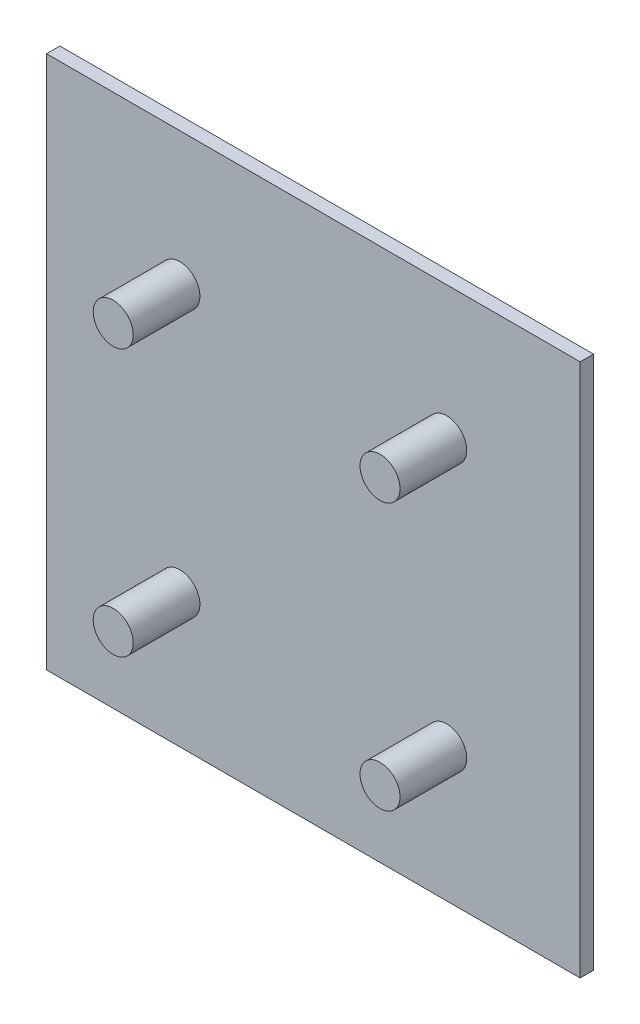
ISO-10303-21;
HEADER;
FILE_DESCRIPTION(('STEP AP214'),'2;1');
FILE_NAME('part.step','',(''),(''),'','','');
FILE_SCHEMA(('AUTOMOTIVE_DESIGN { 1 0 10303 214 1 1 1 1 }'));
ENDSEC;
DATA;
#1=APPLICATION_CONTEXT('core data for automotive mechanical design processes');
#2=APPLICATION_PROTOCOL_DEFINITION('international standard','automotive_design',2000,#1);
#3=PRODUCT_CONTEXT('',#1,'mechanical');
#4=PRODUCT('Part','Part','',(#3));
#5=PRODUCT_RELATED_PRODUCT_CATEGORY('part','',(#4));
#6=PRODUCT_DEFINITION_FORMATION('','',#4);
#7=PRODUCT_DEFINITION_CONTEXT('part definition',#1,'design');
#8=PRODUCT_DEFINITION('design','',#6,#7);
#9=PRODUCT_DEFINITION_SHAPE('','',#8);
#10=(LENGTH_UNIT() NAMED_UNIT(*) SI_UNIT(.MILLI.,.METRE.));
#11=(NAMED_UNIT(*) PLANE_ANGLE_UNIT() SI_UNIT($,.RADIAN.));
#12=(NAMED_UNIT(*) SI_UNIT($,.STERADIAN.) SOLID_ANGLE_UNIT());
#13=UNCERTAINTY_MEASURE_WITH_UNIT(LENGTH_MEASURE(1.E-05),#10,'distance_accuracy_value','');
#14=(GEOMETRIC_REPRESENTATION_CONTEXT(3) GLOBAL_UNCERTAINTY_ASSIGNED_CONTEXT((#13)) GLOBAL_UNIT_ASSIGNED_CONTEXT((#10,
#11,#12)) REPRESENTATION_CONTEXT('',''));
#15=CARTESIAN_POINT('',(0.,0.,0.));
#16=DIRECTION('',(0.,0.,1.));
#17=DIRECTION('',(1.,0.,0.));
#18=AXIS2_PLACEMENT_3D('',#15,#16,#17);
#19=CARTESIAN_POINT('',(20.,-20.,1.5));
#20=DIRECTION('',(-1.,0.,0.));
#21=DIRECTION('',(0.,0.,1.));
#22=AXIS2_PLACEMENT_3D('',#19,#20,#21);
#23=PLANE('',#22);
#24=DIRECTION('',(0.,0.,-1.));
#25=VECTOR('',#24,1.);
#26=CARTESIAN_POINT('',(20.,-20.,1.5));
#27=LINE('',#26,#25);
#28=CARTESIAN_POINT('',(20.,-20.,1.5));
#29=VERTEX_POINT('',#28);
#30=CARTESIAN_POINT('',(20.,-20.,0.5));
#31=VERTEX_POINT('',#30);
#32=EDGE_CURVE('E194',#29,#31,#27,.T.);
#33=ORIENTED_EDGE('',*,*,#32,.T.);
#34=DIRECTION('',(0.,1.,0.));
#35=VECTOR('',#34,1.);
#36=CARTESIAN_POINT('',(20.,20.,0.5));
#37=LINE('',#36,#35);
#38=CARTESIAN_POINT('',(20.,20.,0.5));
#39=VERTEX_POINT('',#38);
#40=EDGE_CURVE('E94',#31,#39,#37,.T.);
#41=ORIENTED_EDGE('',*,*,#40,.T.);
#42=DIRECTION('',(0.,0.,-1.));
#43=VECTOR('',#42,1.);
#44=CARTESIAN_POINT('',(20.,20.,1.5));
#45=LINE('',#44,#43);
#46=CARTESIAN_POINT('',(20.,20.,1.5));
#47=VERTEX_POINT('',#46);
#48=EDGE_CURVE('E77',#47,#39,#45,.T.);
#49=ORIENTED_EDGE('',*,*,#48,.F.);
#50=DIRECTION('',(0.,1.,0.));
#51=VECTOR('',#50,1.);
#52=CARTESIAN_POINT('',(20.,-20.,1.5));
#53=LINE('',#52,#51);
#54=EDGE_CURVE('E81',#29,#47,#53,.T.);
#55=ORIENTED_EDGE('',*,*,#54,.F.);
#56=EDGE_LOOP('',(#33,#41,#49,#55));
#57=FACE_BOUND('',#56,.T.);
#58=ADVANCED_FACE('F17',(#57),#23,.F.);
#59=CARTESIAN_POINT('',(-20.,20.,1.5));
#60=DIRECTION('',(0.,-1.,0.));
#61=DIRECTION('',(0.,0.,-1.));
#62=AXIS2_PLACEMENT_3D('',#59,#60,#61);
#63=PLANE('',#62);
#64=ORIENTED_EDGE('',*,*,#48,.T.);
#65=DIRECTION('',(-1.,0.,0.));
#66=VECTOR('',#65,1.);
#67=CARTESIAN_POINT('',(-20.,20.,0.5));
#68=LINE('',#67,#66);
#69=CARTESIAN_POINT('',(-20.,20.,0.5));
#70=VERTEX_POINT('',#69);
#71=EDGE_CURVE('E92',#39,#70,#68,.T.);
#72=ORIENTED_EDGE('',*,*,#71,.T.);
#73=DIRECTION('',(0.,0.,-1.));
#74=VECTOR('',#73,1.);
#75=CARTESIAN_POINT('',(-20.,20.,1.5));
#76=LINE('',#75,#74);
#77=CARTESIAN_POINT('',(-20.,20.,1.5));
#78=VERTEX_POINT('',#77);
#79=EDGE_CURVE('E79',#78,#70,#76,.T.);
#80=ORIENTED_EDGE('',*,*,#79,.F.);
#81=DIRECTION('',(-1.,0.,0.));
#82=VECTOR('',#81,1.);
#83=CARTESIAN_POINT('',(-20.,20.,1.5));
#84=LINE('',#83,#82);
#85=EDGE_CURVE('E73',#47,#78,#84,.T.);
#86=ORIENTED_EDGE('',*,*,#85,.F.);
#87=EDGE_LOOP('',(#64,#72,#80,#86));
#88=FACE_BOUND('',#87,.T.);
#89=ADVANCED_FACE('F74',(#88),#63,.F.);
#90=CARTESIAN_POINT('',(-20.,-20.,1.5));
#91=DIRECTION('',(1.,0.,0.));
#92=DIRECTION('',(0.,0.,-1.));
#93=AXIS2_PLACEMENT_3D('',#90,#91,#92);
#94=PLANE('',#93);
#95=ORIENTED_EDGE('',*,*,#79,.T.);
#96=DIRECTION('',(0.,-1.,0.));
#97=VECTOR('',#96,1.);
#98=CARTESIAN_POINT('',(-20.,-20.,0.5));
#99=LINE('',#98,#97);
#100=CARTESIAN_POINT('',(-20.,-20.,0.5));
#101=VERTEX_POINT('',#100);
#102=EDGE_CURVE('E37',#70,#101,#99,.T.);
#103=ORIENTED_EDGE('',*,*,#102,.T.);
#104=DIRECTION('',(0.,0.,-1.));
#105=VECTOR('',#104,1.);
#106=CARTESIAN_POINT('',(-20.,-20.,1.5));
#107=LINE('',#106,#105);
#108=CARTESIAN_POINT('',(-20.,-20.,1.5));
#109=VERTEX_POINT('',#108);
#110=EDGE_CURVE('E97',#109,#101,#107,.T.);
#111=ORIENTED_EDGE('',*,*,#110,.F.);
#112=DIRECTION('',(0.,-1.,0.));
#113=VECTOR('',#112,1.);
#114=CARTESIAN_POINT('',(-20.,-20.,1.5));
#115=LINE('',#114,#113);
#116=EDGE_CURVE('E84',#78,#109,#115,.T.);
#117=ORIENTED_EDGE('',*,*,#116,.F.);
#118=EDGE_LOOP('',(#95,#103,#111,#117));
#119=FACE_BOUND('',#118,.T.);
#120=ADVANCED_FACE('F166',(#119),#94,.F.);
#121=CARTESIAN_POINT('',(-20.,-20.,1.5));
#122=DIRECTION('',(0.,1.,0.));
#123=DIRECTION('',(0.,0.,1.));
#124=AXIS2_PLACEMENT_3D('',#121,#122,#123);
#125=PLANE('',#124);
#126=ORIENTED_EDGE('',*,*,#110,.T.);
#127=DIRECTION('',(1.,0.,0.));
#128=VECTOR('',#127,1.);
#129=CARTESIAN_POINT('',(20.,-20.,0.5));
#130=LINE('',#129,#128);
#131=EDGE_CURVE('E32',#101,#31,#130,.T.);
#132=ORIENTED_EDGE('',*,*,#131,.T.);
#133=ORIENTED_EDGE('',*,*,#32,.F.);
#134=DIRECTION('',(1.,0.,0.));
#135=VECTOR('',#134,1.);
#136=CARTESIAN_POINT('',(-20.,-20.,1.5));
#137=LINE('',#136,#135);
#138=EDGE_CURVE('E90',#109,#29,#137,.T.);
#139=ORIENTED_EDGE('',*,*,#138,.F.);
#140=EDGE_LOOP('',(#126,#132,#133,#139));
#141=FACE_BOUND('',#140,.T.);
#142=ADVANCED_FACE('F140',(#141),#125,.F.);
#143=CARTESIAN_POINT('',(0.,0.,1.5));
#144=DIRECTION('',(0.,0.,-1.));
#145=DIRECTION('',(-1.,0.,0.));
#146=AXIS2_PLACEMENT_3D('',#143,#144,#145);
#147=PLANE('',#146);
#148=CARTESIAN_POINT('',(-10.,-10.,1.5));
#149=DIRECTION('',(0.,0.,-1.));
#150=DIRECTION('',(-1.,0.,0.));
#151=AXIS2_PLACEMENT_3D('',#148,#149,#150);
#152=CIRCLE('',#151,1.5);
#153=CARTESIAN_POINT('',(-11.5,-10.,1.5));
#154=VERTEX_POINT('',#153);
#155=EDGE_CURVE('E11',#154,#154,#152,.F.);
#156=ORIENTED_EDGE('',*,*,#155,.F.);
#157=EDGE_LOOP('',(#156));
#158=FACE_BOUND('',#157,.T.);
#159=CARTESIAN_POINT('',(10.,-10.,1.5));
#160=DIRECTION('',(0.,0.,-1.));
#161=DIRECTION('',(-1.,0.,0.));
#162=AXIS2_PLACEMENT_3D('',#159,#160,#161);
#163=CIRCLE('',#162,1.5);
#164=CARTESIAN_POINT('',(8.5,-10.,1.5));
#165=VERTEX_POINT('',#164);
#166=EDGE_CURVE('E25',#165,#165,#163,.F.);
#167=ORIENTED_EDGE('',*,*,#166,.F.);
#168=EDGE_LOOP('',(#167));
#169=FACE_BOUND('',#168,.T.);
#170=CARTESIAN_POINT('',(10.,10.,1.5));
#171=DIRECTION('',(0.,0.,-1.));
#172=DIRECTION('',(-1.,0.,0.));
#173=AXIS2_PLACEMENT_3D('',#170,#171,#172);
#174=CIRCLE('',#173,1.5);
#175=CARTESIAN_POINT('',(8.5,10.,1.5));
#176=VERTEX_POINT('',#175);
#177=EDGE_CURVE('E126',#176,#176,#174,.F.);
#178=ORIENTED_EDGE('',*,*,#177,.F.);
#179=EDGE_LOOP('',(#178));
#180=FACE_BOUND('',#179,.T.);
#181=CARTESIAN_POINT('',(-10.,10.,1.5));
#182=DIRECTION('',(0.,0.,-1.));
#183=DIRECTION('',(-1.,0.,0.));
#184=AXIS2_PLACEMENT_3D('',#181,#182,#183);
#185=CIRCLE('',#184,1.5);
#186=CARTESIAN_POINT('',(-11.5,10.,1.5));
#187=VERTEX_POINT('',#186);
#188=EDGE_CURVE('E111',#187,#187,#185,.F.);
#189=ORIENTED_EDGE('',*,*,#188,.F.);
#190=EDGE_LOOP('',(#189));
#191=FACE_BOUND('',#190,.T.);
#192=ORIENTED_EDGE('',*,*,#54,.T.);
#193=ORIENTED_EDGE('',*,*,#85,.T.);
#194=ORIENTED_EDGE('',*,*,#116,.T.);
#195=ORIENTED_EDGE('',*,*,#138,.T.);
#196=EDGE_LOOP('',(#192,#193,#194,#195));
#197=FACE_BOUND('',#196,.T.);
#198=ADVANCED_FACE('F87',(#158,#169,#180,#191,#197),#147,.F.);
#199=CARTESIAN_POINT('',(0.,0.,0.));
#200=DIRECTION('',(0.,0.,-1.));
#201=DIRECTION('',(-1.,0.,0.));
#202=AXIS2_PLACEMENT_3D('',#199,#200,#201);
#203=PLANE('',#202);
#204=DIRECTION('',(0.,1.,0.));
#205=VECTOR('',#204,1.);
#206=CARTESIAN_POINT('',(-19.5,20.,0.));
#207=LINE('',#206,#205);
#208=CARTESIAN_POINT('',(-19.5,-19.5,0.));
#209=VERTEX_POINT('',#208);
#210=CARTESIAN_POINT('',(-19.5,19.5,0.));
#211=VERTEX_POINT('',#210);
#212=EDGE_CURVE('E106',#209,#211,#207,.T.);
#213=ORIENTED_EDGE('',*,*,#212,.T.);
#214=DIRECTION('',(1.,0.,0.));
#215=VECTOR('',#214,1.);
#216=CARTESIAN_POINT('',(20.,19.5,0.));
#217=LINE('',#216,#215);
#218=CARTESIAN_POINT('',(19.5,19.5,0.));
#219=VERTEX_POINT('',#218);
#220=EDGE_CURVE('E107',#211,#219,#217,.T.);
#221=ORIENTED_EDGE('',*,*,#220,.T.);
#222=DIRECTION('',(0.,-1.,0.));
#223=VECTOR('',#222,1.);
#224=CARTESIAN_POINT('',(19.5,-20.,0.));
#225=LINE('',#224,#223);
#226=CARTESIAN_POINT('',(19.5,-19.5,0.));
#227=VERTEX_POINT('',#226);
#228=EDGE_CURVE('E100',#219,#227,#225,.T.);
#229=ORIENTED_EDGE('',*,*,#228,.T.);
#230=DIRECTION('',(-1.,0.,0.));
#231=VECTOR('',#230,1.);
#232=CARTESIAN_POINT('',(-20.,-19.5,0.));
#233=LINE('',#232,#231);
#234=EDGE_CURVE('E102',#227,#209,#233,.T.);
#235=ORIENTED_EDGE('',*,*,#234,.T.);
#236=EDGE_LOOP('',(#213,#221,#229,#235));
#237=FACE_BOUND('',#236,.T.);
#238=ADVANCED_FACE('F137',(#237),#203,.T.);
#239=CARTESIAN_POINT('',(-20.,-20.,0.5));
#240=DIRECTION('',(0.,-0.707106781186548,-0.707106781186548));
#241=DIRECTION('',(-1.,0.,0.));
#242=AXIS2_PLACEMENT_3D('',#239,#240,#241);
#243=PLANE('',#242);
#244=DIRECTION('',(0.577350269189626,0.577350269189626,-0.577350269189626));
#245=VECTOR('',#244,1.);
#246=CARTESIAN_POINT('',(-20.,-20.,0.5));
#247=LINE('',#246,#245);
#248=EDGE_CURVE('E120',#209,#101,#247,.F.);
#249=ORIENTED_EDGE('',*,*,#248,.F.);
#250=ORIENTED_EDGE('',*,*,#234,.F.);
#251=DIRECTION('',(-0.577350269189626,0.577350269189626,-0.577350269189626));
#252=VECTOR('',#251,1.);
#253=CARTESIAN_POINT('',(20.,-20.,0.5));
#254=LINE('',#253,#252);
#255=EDGE_CURVE('E93',#31,#227,#254,.T.);
#256=ORIENTED_EDGE('',*,*,#255,.F.);
#257=ORIENTED_EDGE('',*,*,#131,.F.);
#258=EDGE_LOOP('',(#249,#250,#256,#257));
#259=FACE_BOUND('',#258,.T.);
#260=ADVANCED_FACE('F19',(#259),#243,.T.);
#261=CARTESIAN_POINT('',(20.,-20.,0.5));
#262=DIRECTION('',(0.707106781186548,0.,-0.707106781186548));
#263=DIRECTION('',(0.,-1.,0.));
#264=AXIS2_PLACEMENT_3D('',#261,#262,#263);
#265=PLANE('',#264);
#266=ORIENTED_EDGE('',*,*,#255,.T.);
#267=ORIENTED_EDGE('',*,*,#228,.F.);
#268=DIRECTION('',(0.577350269189626,0.577350269189626,0.577350269189626));
#269=VECTOR('',#268,1.);
#270=CARTESIAN_POINT('',(6.66666666666667,6.66666666666666,-12.8333333333333));
#271=LINE('',#270,#269);
#272=EDGE_CURVE('E117',#39,#219,#271,.F.);
#273=ORIENTED_EDGE('',*,*,#272,.F.);
#274=ORIENTED_EDGE('',*,*,#40,.F.);
#275=EDGE_LOOP('',(#266,#267,#273,#274));
#276=FACE_BOUND('',#275,.T.);
#277=ADVANCED_FACE('F173',(#276),#265,.T.);
#278=CARTESIAN_POINT('',(-20.,-20.,0.5));
#279=DIRECTION('',(-0.707106781186548,0.,-0.707106781186548));
#280=DIRECTION('',(0.,1.,0.));
#281=AXIS2_PLACEMENT_3D('',#278,#279,#280);
#282=PLANE('',#281);
#283=ORIENTED_EDGE('',*,*,#248,.T.);
#284=ORIENTED_EDGE('',*,*,#102,.F.);
#285=DIRECTION('',(0.577350269189626,-0.577350269189626,-0.577350269189626));
#286=VECTOR('',#285,1.);
#287=CARTESIAN_POINT('',(-6.66666666666667,6.66666666666666,-12.8333333333333));
#288=LINE('',#287,#286);
#289=EDGE_CURVE('E113',#211,#70,#288,.F.);
#290=ORIENTED_EDGE('',*,*,#289,.F.);
#291=ORIENTED_EDGE('',*,*,#212,.F.);
#292=EDGE_LOOP('',(#283,#284,#290,#291));
#293=FACE_BOUND('',#292,.T.);
#294=ADVANCED_FACE('F157',(#293),#282,.T.);
#295=CARTESIAN_POINT('',(-20.,20.,0.5));
#296=DIRECTION('',(0.,0.707106781186548,-0.707106781186548));
#297=DIRECTION('',(1.,0.,0.));
#298=AXIS2_PLACEMENT_3D('',#295,#296,#297);
#299=PLANE('',#298);
#300=ORIENTED_EDGE('',*,*,#272,.T.);
#301=ORIENTED_EDGE('',*,*,#220,.F.);
#302=ORIENTED_EDGE('',*,*,#289,.T.);
#303=ORIENTED_EDGE('',*,*,#71,.F.);
#304=EDGE_LOOP('',(#300,#301,#302,#303));
#305=FACE_BOUND('',#304,.T.);
#306=ADVANCED_FACE('F150',(#305),#299,.T.);
#307=CARTESIAN_POINT('',(-10.,10.,6.5));
#308=DIRECTION('',(0.,0.,-1.));
#309=DIRECTION('',(-1.,0.,0.));
#310=AXIS2_PLACEMENT_3D('',#307,#308,#309);
#311=CYLINDRICAL_SURFACE('',#310,1.5);
#312=CARTESIAN_POINT('',(-10.,10.,6.5));
#313=DIRECTION('',(0.,0.,1.));
#314=DIRECTION('',(1.,0.,0.));
#315=AXIS2_PLACEMENT_3D('',#312,#313,#314);
#316=CIRCLE('',#315,1.5);
#317=CARTESIAN_POINT('',(-8.5,10.,6.5));
#318=VERTEX_POINT('',#317);
#319=EDGE_CURVE('E119',#318,#318,#316,.T.);
#320=ORIENTED_EDGE('',*,*,#319,.F.);
#321=EDGE_LOOP('',(#320));
#322=FACE_BOUND('',#321,.T.);
#323=ORIENTED_EDGE('',*,*,#188,.T.);
#324=EDGE_LOOP('',(#323));
#325=FACE_BOUND('',#324,.T.);
#326=ADVANCED_FACE('F145',(#322,#325),#311,.T.);
#327=CARTESIAN_POINT('',(-10.,10.,6.5));
#328=DIRECTION('',(0.,0.,1.));
#329=DIRECTION('',(1.,0.,0.));
#330=AXIS2_PLACEMENT_3D('',#327,#328,#329);
#331=PLANE('',#330);
#332=ORIENTED_EDGE('',*,*,#319,.T.);
#333=EDGE_LOOP('',(#332));
#334=FACE_BOUND('',#333,.T.);
#335=ADVANCED_FACE('F148',(#334),#331,.T.);
#336=CARTESIAN_POINT('',(10.,10.,6.5));
#337=DIRECTION('',(0.,0.,-1.));
#338=DIRECTION('',(-1.,0.,0.));
#339=AXIS2_PLACEMENT_3D('',#336,#337,#338);
#340=CYLINDRICAL_SURFACE('',#339,1.5);
#341=CARTESIAN_POINT('',(10.,10.,6.5));
#342=DIRECTION('',(0.,0.,1.));
#343=DIRECTION('',(-1.,0.,0.));
#344=AXIS2_PLACEMENT_3D('',#341,#342,#343);
#345=CIRCLE('',#344,1.5);
#346=CARTESIAN_POINT('',(8.5,10.,6.5));
#347=VERTEX_POINT('',#346);
#348=EDGE_CURVE('E300',#347,#347,#345,.T.);
#349=ORIENTED_EDGE('',*,*,#348,.F.);
#350=EDGE_LOOP('',(#349));
#351=FACE_BOUND('',#350,.T.);
#352=ORIENTED_EDGE('',*,*,#177,.T.);
#353=EDGE_LOOP('',(#352));
#354=FACE_BOUND('',#353,.T.);
#355=ADVANCED_FACE('F156',(#351,#354),#340,.T.);
#356=CARTESIAN_POINT('',(10.,10.,6.5));
#357=DIRECTION('',(0.,0.,-1.));
#358=DIRECTION('',(-1.,0.,0.));
#359=AXIS2_PLACEMENT_3D('',#356,#357,#358);
#360=PLANE('',#359);
#361=ORIENTED_EDGE('',*,*,#348,.T.);
#362=EDGE_LOOP('',(#361));
#363=FACE_BOUND('',#362,.T.);
#364=ADVANCED_FACE('F248',(#363),#360,.F.);
#365=CARTESIAN_POINT('',(10.,-10.,6.5));
#366=DIRECTION('',(0.,0.,-1.));
#367=DIRECTION('',(-1.,0.,0.));
#368=AXIS2_PLACEMENT_3D('',#365,#366,#367);
#369=CYLINDRICAL_SURFACE('',#368,1.5);
#370=CARTESIAN_POINT('',(10.,-10.,6.5));
#371=DIRECTION('',(0.,0.,1.));
#372=DIRECTION('',(1.,0.,0.));
#373=AXIS2_PLACEMENT_3D('',#370,#371,#372);
#374=CIRCLE('',#373,1.5);
#375=CARTESIAN_POINT('',(11.5,-10.,6.5));
#376=VERTEX_POINT('',#375);
#377=EDGE_CURVE('E292',#376,#376,#374,.T.);
#378=ORIENTED_EDGE('',*,*,#377,.F.);
#379=EDGE_LOOP('',(#378));
#380=FACE_BOUND('',#379,.T.);
#381=ORIENTED_EDGE('',*,*,#166,.T.);
#382=EDGE_LOOP('',(#381));
#383=FACE_BOUND('',#382,.T.);
#384=ADVANCED_FACE('F135',(#380,#383),#369,.T.);
#385=CARTESIAN_POINT('',(10.,-10.,6.5));
#386=DIRECTION('',(0.,0.,1.));
#387=DIRECTION('',(1.,0.,0.));
#388=AXIS2_PLACEMENT_3D('',#385,#386,#387);
#389=PLANE('',#388);
#390=ORIENTED_EDGE('',*,*,#377,.T.);
#391=EDGE_LOOP('',(#390));
#392=FACE_BOUND('',#391,.T.);
#393=ADVANCED_FACE('F264',(#392),#389,.T.);
#394=CARTESIAN_POINT('',(-10.,-10.,6.5));
#395=DIRECTION('',(0.,0.,-1.));
#396=DIRECTION('',(-1.,0.,0.));
#397=AXIS2_PLACEMENT_3D('',#394,#395,#396);
#398=CYLINDRICAL_SURFACE('',#397,1.5);
#399=CARTESIAN_POINT('',(-10.,-10.,6.5));
#400=DIRECTION('',(0.,0.,1.));
#401=DIRECTION('',(-1.,0.,0.));
#402=AXIS2_PLACEMENT_3D('',#399,#400,#401);
#403=CIRCLE('',#402,1.5);
#404=CARTESIAN_POINT('',(-11.5,-10.,6.5));
#405=VERTEX_POINT('',#404);
#406=EDGE_CURVE('E293',#405,#405,#403,.T.);
#407=ORIENTED_EDGE('',*,*,#406,.F.);
#408=EDGE_LOOP('',(#407));
#409=FACE_BOUND('',#408,.T.);
#410=ORIENTED_EDGE('',*,*,#155,.T.);
#411=EDGE_LOOP('',(#410));
#412=FACE_BOUND('',#411,.T.);
#413=ADVANCED_FACE('F272',(#409,#412),#398,.T.);
#414=CARTESIAN_POINT('',(-10.,-10.,6.5));
#415=DIRECTION('',(0.,0.,-1.));
#416=DIRECTION('',(-1.,0.,0.));
#417=AXIS2_PLACEMENT_3D('',#414,#415,#416);
#418=PLANE('',#417);
#419=ORIENTED_EDGE('',*,*,#406,.T.);
#420=EDGE_LOOP('',(#419));
#421=FACE_BOUND('',#420,.T.);
#422=ADVANCED_FACE('F281',(#421),#418,.F.);
#423=CLOSED_SHELL('',(#58,#89,#120,#142,#198,#238,#260,#277,#294,#306,#326,#335,#355,#364,#384,
#393,#413,#422));
#424=MANIFOLD_SOLID_BREP('B1',#423);
#425=ADVANCED_BREP_SHAPE_REPRESENTATION('',(#18,#424),#14);
#426=SHAPE_DEFINITION_REPRESENTATION(#9,#425);
ENDSEC;
END-ISO-10303-21;
